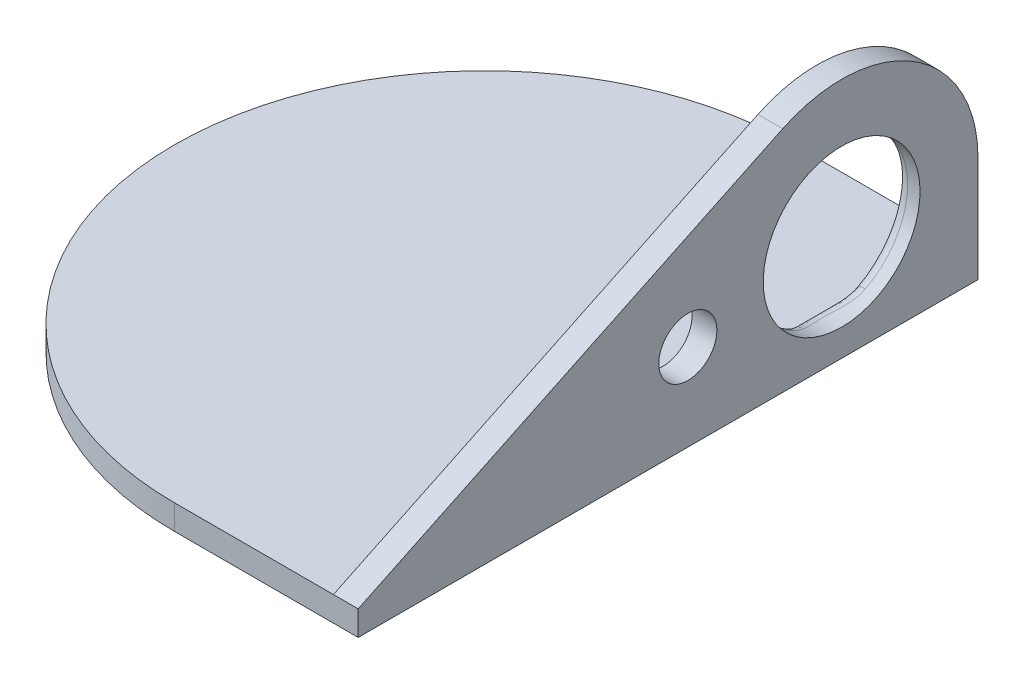
ISO-10303-21;
HEADER;
FILE_DESCRIPTION(('STEP AP214'),'2;1');
FILE_NAME('part.step','',(''),(''),'','','');
FILE_SCHEMA(('AUTOMOTIVE_DESIGN { 1 0 10303 214 1 1 1 1 }'));
ENDSEC;
DATA;
#1=APPLICATION_CONTEXT('core data for automotive mechanical design processes');
#2=APPLICATION_PROTOCOL_DEFINITION('international standard','automotive_design',2000,#1);
#3=PRODUCT_CONTEXT('',#1,'mechanical');
#4=PRODUCT('Part','Part','',(#3));
#5=PRODUCT_RELATED_PRODUCT_CATEGORY('part','',(#4));
#6=PRODUCT_DEFINITION_FORMATION('','',#4);
#7=PRODUCT_DEFINITION_CONTEXT('part definition',#1,'design');
#8=PRODUCT_DEFINITION('design','',#6,#7);
#9=PRODUCT_DEFINITION_SHAPE('','',#8);
#10=(LENGTH_UNIT() NAMED_UNIT(*) SI_UNIT(.MILLI.,.METRE.));
#11=(NAMED_UNIT(*) PLANE_ANGLE_UNIT() SI_UNIT($,.RADIAN.));
#12=(NAMED_UNIT(*) SI_UNIT($,.STERADIAN.) SOLID_ANGLE_UNIT());
#13=UNCERTAINTY_MEASURE_WITH_UNIT(LENGTH_MEASURE(1.E-05),#10,'distance_accuracy_value','');
#14=(GEOMETRIC_REPRESENTATION_CONTEXT(3) GLOBAL_UNCERTAINTY_ASSIGNED_CONTEXT((#13)) GLOBAL_UNIT_ASSIGNED_CONTEXT((#10,
#11,#12)) REPRESENTATION_CONTEXT('',''));
#15=CARTESIAN_POINT('',(0.,0.,0.));
#16=DIRECTION('',(0.,0.,1.));
#17=DIRECTION('',(1.,0.,0.));
#18=AXIS2_PLACEMENT_3D('',#15,#16,#17);
#19=CARTESIAN_POINT('',(0.,0.,12.7));
#20=DIRECTION('',(0.,1.,0.));
#21=DIRECTION('',(-1.,0.,0.));
#22=AXIS2_PLACEMENT_3D('',#19,#20,#21);
#23=PLANE('',#22);
#24=CARTESIAN_POINT('',(-6.5200926909055,0.,0.));
#25=DIRECTION('',(0.,1.,0.));
#26=DIRECTION('',(-1.,0.,0.));
#27=AXIS2_PLACEMENT_3D('',#24,#25,#26);
#28=CIRCLE('',#27,12.7);
#29=CARTESIAN_POINT('',(-15.0630371746587,0.,-9.39723893212848));
#30=VERTEX_POINT('',#29);
#31=CARTESIAN_POINT('',(-15.0630371746587,0.,9.39723893212848));
#32=VERTEX_POINT('',#31);
#33=EDGE_CURVE('E182',#30,#32,#28,.T.);
#34=ORIENTED_EDGE('',*,*,#33,.T.);
#35=CARTESIAN_POINT('',(-6.5200926909055,0.,0.));
#36=DIRECTION('',(0.,1.,0.));
#37=DIRECTION('',(-1.,0.,0.));
#38=AXIS2_PLACEMENT_3D('',#35,#36,#37);
#39=CIRCLE('',#38,12.7);
#40=CARTESIAN_POINT('',(-6.5200926909055,0.,12.7));
#41=VERTEX_POINT('',#40);
#42=EDGE_CURVE('E187',#32,#41,#39,.T.);
#43=ORIENTED_EDGE('',*,*,#42,.T.);
#44=DIRECTION('',(1.,0.,0.));
#45=VECTOR('',#44,1.);
#46=CARTESIAN_POINT('',(0.,0.,12.7));
#47=LINE('',#46,#45);
#48=CARTESIAN_POINT('',(0.,0.,12.7));
#49=VERTEX_POINT('',#48);
#50=EDGE_CURVE('E164',#41,#49,#47,.T.);
#51=ORIENTED_EDGE('',*,*,#50,.T.);
#52=DIRECTION('',(0.,0.,-1.));
#53=VECTOR('',#52,1.);
#54=CARTESIAN_POINT('',(0.,0.,12.7));
#55=LINE('',#54,#53);
#56=CARTESIAN_POINT('',(0.,0.,-5.39637148251727));
#57=VERTEX_POINT('',#56);
#58=EDGE_CURVE('E180',#49,#57,#55,.T.);
#59=ORIENTED_EDGE('',*,*,#58,.T.);
#60=CARTESIAN_POINT('',(0.,0.,-8.82762851748273));
#61=VERTEX_POINT('',#60);
#62=EDGE_CURVE('E183',#57,#61,#55,.T.);
#63=ORIENTED_EDGE('',*,*,#62,.T.);
#64=CARTESIAN_POINT('',(0.,0.,-12.7));
#65=VERTEX_POINT('',#64);
#66=EDGE_CURVE('E179',#61,#65,#55,.T.);
#67=ORIENTED_EDGE('',*,*,#66,.T.);
#68=DIRECTION('',(1.,0.,0.));
#69=VECTOR('',#68,1.);
#70=CARTESIAN_POINT('',(0.,0.,-12.7));
#71=LINE('',#70,#69);
#72=CARTESIAN_POINT('',(-6.5200926909055,0.,-12.7));
#73=VERTEX_POINT('',#72);
#74=EDGE_CURVE('E174',#73,#65,#71,.T.);
#75=ORIENTED_EDGE('',*,*,#74,.F.);
#76=CARTESIAN_POINT('',(-6.5200926909055,0.,0.));
#77=DIRECTION('',(0.,1.,0.));
#78=DIRECTION('',(-1.,0.,0.));
#79=AXIS2_PLACEMENT_3D('',#76,#77,#78);
#80=CIRCLE('',#79,12.7);
#81=EDGE_CURVE('E185',#73,#30,#80,.T.);
#82=ORIENTED_EDGE('',*,*,#81,.T.);
#83=EDGE_LOOP('',(#34,#43,#51,#59,#63,#67,#75,#82));
#84=FACE_BOUND('',#83,.T.);
#85=ADVANCED_FACE('F35',(#84),#23,.T.);
#86=CARTESIAN_POINT('',(0.,-1.016,12.7));
#87=DIRECTION('',(0.,1.,0.));
#88=DIRECTION('',(-1.,0.,0.));
#89=AXIS2_PLACEMENT_3D('',#86,#87,#88);
#90=PLANE('',#89);
#91=DIRECTION('',(1.,0.,0.));
#92=VECTOR('',#91,1.);
#93=CARTESIAN_POINT('',(0.,-1.016,12.7));
#94=LINE('',#93,#92);
#95=CARTESIAN_POINT('',(-6.5200926909055,-1.016,12.7));
#96=VERTEX_POINT('',#95);
#97=CARTESIAN_POINT('',(1.016,-1.016,12.7));
#98=VERTEX_POINT('',#97);
#99=EDGE_CURVE('E167',#96,#98,#94,.T.);
#100=ORIENTED_EDGE('',*,*,#99,.F.);
#101=CARTESIAN_POINT('',(-6.5200926909055,-1.016,0.));
#102=DIRECTION('',(0.,1.,0.));
#103=DIRECTION('',(-1.,0.,0.));
#104=AXIS2_PLACEMENT_3D('',#101,#102,#103);
#105=CIRCLE('',#104,12.7);
#106=CARTESIAN_POINT('',(-15.0630371746587,-1.016,9.39723893212848));
#107=VERTEX_POINT('',#106);
#108=EDGE_CURVE('E196',#96,#107,#105,.F.);
#109=ORIENTED_EDGE('',*,*,#108,.T.);
#110=CARTESIAN_POINT('',(-6.5200926909055,-1.016,0.));
#111=DIRECTION('',(0.,1.,0.));
#112=DIRECTION('',(-1.,0.,0.));
#113=AXIS2_PLACEMENT_3D('',#110,#111,#112);
#114=CIRCLE('',#113,12.7);
#115=CARTESIAN_POINT('',(-15.0630371746587,-1.016,-9.39723893212848));
#116=VERTEX_POINT('',#115);
#117=EDGE_CURVE('E192',#107,#116,#114,.F.);
#118=ORIENTED_EDGE('',*,*,#117,.T.);
#119=CARTESIAN_POINT('',(-6.5200926909055,-1.016,0.));
#120=DIRECTION('',(0.,1.,0.));
#121=DIRECTION('',(-1.,0.,0.));
#122=AXIS2_PLACEMENT_3D('',#119,#120,#121);
#123=CIRCLE('',#122,12.7);
#124=CARTESIAN_POINT('',(-6.5200926909055,-1.016,-12.7));
#125=VERTEX_POINT('',#124);
#126=EDGE_CURVE('E194',#116,#125,#123,.F.);
#127=ORIENTED_EDGE('',*,*,#126,.T.);
#128=DIRECTION('',(1.,0.,0.));
#129=VECTOR('',#128,1.);
#130=CARTESIAN_POINT('',(0.,-1.016,-12.7));
#131=LINE('',#130,#129);
#132=CARTESIAN_POINT('',(1.016,-1.016,-12.7));
#133=VERTEX_POINT('',#132);
#134=EDGE_CURVE('E165',#125,#133,#131,.T.);
#135=ORIENTED_EDGE('',*,*,#134,.T.);
#136=DIRECTION('',(0.,0.,-1.));
#137=VECTOR('',#136,1.);
#138=CARTESIAN_POINT('',(1.016,-1.016,12.7));
#139=LINE('',#138,#137);
#140=EDGE_CURVE('E169',#98,#133,#139,.T.);
#141=ORIENTED_EDGE('',*,*,#140,.F.);
#142=EDGE_LOOP('',(#100,#109,#118,#127,#135,#141));
#143=FACE_BOUND('',#142,.T.);
#144=ADVANCED_FACE('F264',(#143),#90,.F.);
#145=CARTESIAN_POINT('',(0.,0.,12.7));
#146=DIRECTION('',(0.,0.,-1.));
#147=DIRECTION('',(-1.,0.,0.));
#148=AXIS2_PLACEMENT_3D('',#145,#146,#147);
#149=PLANE('',#148);
#150=ORIENTED_EDGE('',*,*,#50,.F.);
#151=DIRECTION('',(0.,1.,0.));
#152=VECTOR('',#151,1.);
#153=CARTESIAN_POINT('',(-6.5200926909055,-1.016,12.7));
#154=LINE('',#153,#152);
#155=EDGE_CURVE('E189',#41,#96,#154,.F.);
#156=ORIENTED_EDGE('',*,*,#155,.T.);
#157=ORIENTED_EDGE('',*,*,#99,.T.);
#158=DIRECTION('',(0.,1.,0.));
#159=VECTOR('',#158,1.);
#160=CARTESIAN_POINT('',(1.016,0.,12.7));
#161=LINE('',#160,#159);
#162=CARTESIAN_POINT('',(1.01600000000001,0.,12.7));
#163=VERTEX_POINT('',#162);
#164=EDGE_CURVE('E162',#98,#163,#161,.T.);
#165=ORIENTED_EDGE('',*,*,#164,.T.);
#166=DIRECTION('',(-1.,0.,0.));
#167=VECTOR('',#166,1.);
#168=CARTESIAN_POINT('',(1.01600000000001,0.,12.7));
#169=LINE('',#168,#167);
#170=EDGE_CURVE('E132',#163,#49,#169,.T.);
#171=ORIENTED_EDGE('',*,*,#170,.T.);
#172=EDGE_LOOP('',(#150,#156,#157,#165,#171));
#173=FACE_BOUND('',#172,.T.);
#174=ADVANCED_FACE('F258',(#173),#149,.F.);
#175=CARTESIAN_POINT('',(0.,0.,-12.7));
#176=DIRECTION('',(0.,0.,-1.));
#177=DIRECTION('',(-1.,0.,0.));
#178=AXIS2_PLACEMENT_3D('',#175,#176,#177);
#179=PLANE('',#178);
#180=ORIENTED_EDGE('',*,*,#134,.F.);
#181=DIRECTION('',(0.,1.,0.));
#182=VECTOR('',#181,1.);
#183=CARTESIAN_POINT('',(-6.5200926909055,0.,-12.7));
#184=LINE('',#183,#182);
#185=EDGE_CURVE('E198',#125,#73,#184,.T.);
#186=ORIENTED_EDGE('',*,*,#185,.T.);
#187=ORIENTED_EDGE('',*,*,#74,.T.);
#188=DIRECTION('',(0.,1.,0.));
#189=VECTOR('',#188,1.);
#190=CARTESIAN_POINT('',(0.,0.,-12.7));
#191=LINE('',#190,#189);
#192=CARTESIAN_POINT('',(0.,3.302,-12.7));
#193=VERTEX_POINT('',#192);
#194=EDGE_CURVE('E171',#65,#193,#191,.T.);
#195=ORIENTED_EDGE('',*,*,#194,.T.);
#196=DIRECTION('',(-1.,0.,0.));
#197=VECTOR('',#196,1.);
#198=CARTESIAN_POINT('',(1.01600000000001,3.302,-12.7));
#199=LINE('',#198,#197);
#200=CARTESIAN_POINT('',(1.016,3.302,-12.7));
#201=VERTEX_POINT('',#200);
#202=EDGE_CURVE('E133',#201,#193,#199,.T.);
#203=ORIENTED_EDGE('',*,*,#202,.F.);
#204=DIRECTION('',(0.,1.,0.));
#205=VECTOR('',#204,1.);
#206=CARTESIAN_POINT('',(1.016,0.,-12.7));
#207=LINE('',#206,#205);
#208=EDGE_CURVE('E147',#133,#201,#207,.T.);
#209=ORIENTED_EDGE('',*,*,#208,.F.);
#210=EDGE_LOOP('',(#180,#186,#187,#195,#203,#209));
#211=FACE_BOUND('',#210,.T.);
#212=ADVANCED_FACE('F250',(#211),#179,.T.);
#213=CARTESIAN_POINT('',(1.016,0.,12.7));
#214=DIRECTION('',(-1.,0.,0.));
#215=DIRECTION('',(0.,-1.,0.));
#216=AXIS2_PLACEMENT_3D('',#213,#214,#215);
#217=PLANE('',#216);
#218=CARTESIAN_POINT('',(1.01600000000001,2.54,-0.807885787836645));
#219=DIRECTION('',(-1.,0.,0.));
#220=DIRECTION('',(0.,-1.,0.));
#221=AXIS2_PLACEMENT_3D('',#218,#219,#220);
#222=CIRCLE('',#221,1.190625);
#223=CARTESIAN_POINT('',(1.01600000000001,1.349375,-0.807885787836645));
#224=VERTEX_POINT('',#223);
#225=EDGE_CURVE('E155',#224,#224,#222,.T.);
#226=ORIENTED_EDGE('',*,*,#225,.T.);
#227=EDGE_LOOP('',(#226));
#228=FACE_BOUND('',#227,.T.);
#229=CARTESIAN_POINT('',(1.016,3.302,-7.112));
#230=DIRECTION('',(-1.,0.,0.));
#231=DIRECTION('',(0.,-1.,0.));
#232=AXIS2_PLACEMENT_3D('',#229,#230,#231);
#233=CIRCLE('',#232,3.2131);
#234=CARTESIAN_POINT('',(1.01600000000001,0.0889000000000003,-7.112));
#235=VERTEX_POINT('',#234);
#236=EDGE_CURVE('E157',#235,#235,#233,.T.);
#237=ORIENTED_EDGE('',*,*,#236,.T.);
#238=EDGE_LOOP('',(#237));
#239=FACE_BOUND('',#238,.T.);
#240=CARTESIAN_POINT('',(1.01600000000001,3.302,-7.112));
#241=DIRECTION('',(1.,0.,0.));
#242=DIRECTION('',(0.,-1.,0.));
#243=AXIS2_PLACEMENT_3D('',#240,#241,#242);
#244=CIRCLE('',#243,5.588);
#245=CARTESIAN_POINT('',(1.01600000000001,8.34076814817256,-4.69610274453534));
#246=VERTEX_POINT('',#245);
#247=EDGE_CURVE('E125',#201,#246,#244,.T.);
#248=ORIENTED_EDGE('',*,*,#247,.T.);
#249=DIRECTION('',(0.,-0.432336659889881,0.901712267031596));
#250=VECTOR('',#249,1.);
#251=CARTESIAN_POINT('',(1.01600000000001,0.,12.7));
#252=LINE('',#251,#250);
#253=EDGE_CURVE('E136',#246,#163,#252,.T.);
#254=ORIENTED_EDGE('',*,*,#253,.T.);
#255=ORIENTED_EDGE('',*,*,#164,.F.);
#256=ORIENTED_EDGE('',*,*,#140,.T.);
#257=ORIENTED_EDGE('',*,*,#208,.T.);
#258=EDGE_LOOP('',(#248,#254,#255,#256,#257));
#259=FACE_BOUND('',#258,.T.);
#260=ADVANCED_FACE('F144',(#228,#239,#259),#217,.F.);
#261=CARTESIAN_POINT('',(0.,0.,12.7));
#262=DIRECTION('',(-1.,0.,0.));
#263=DIRECTION('',(0.,-1.,0.));
#264=AXIS2_PLACEMENT_3D('',#261,#262,#263);
#265=PLANE('',#264);
#266=CARTESIAN_POINT('',(0.,2.54,-0.807885787836645));
#267=DIRECTION('',(-1.,0.,0.));
#268=DIRECTION('',(0.,-1.,0.));
#269=AXIS2_PLACEMENT_3D('',#266,#267,#268);
#270=CIRCLE('',#269,1.190625);
#271=CARTESIAN_POINT('',(0.,1.349375,-0.807885787836645));
#272=VERTEX_POINT('',#271);
#273=EDGE_CURVE('E152',#272,#272,#270,.T.);
#274=ORIENTED_EDGE('',*,*,#273,.F.);
#275=EDGE_LOOP('',(#274));
#276=FACE_BOUND('',#275,.T.);
#277=ORIENTED_EDGE('',*,*,#66,.F.);
#278=CARTESIAN_POINT('',(0.,3.302,-7.112));
#279=DIRECTION('',(-1.,0.,0.));
#280=DIRECTION('',(0.,-1.,0.));
#281=AXIS2_PLACEMENT_3D('',#278,#279,#280);
#282=CIRCLE('',#281,3.7211);
#283=EDGE_CURVE('E11',#61,#57,#282,.F.);
#284=ORIENTED_EDGE('',*,*,#283,.T.);
#285=ORIENTED_EDGE('',*,*,#58,.F.);
#286=DIRECTION('',(0.,-0.432336659889881,0.901712267031596));
#287=VECTOR('',#286,1.);
#288=CARTESIAN_POINT('',(0.,0.,12.7));
#289=LINE('',#288,#287);
#290=CARTESIAN_POINT('',(0.,8.34076814817256,-4.69610274453534));
#291=VERTEX_POINT('',#290);
#292=EDGE_CURVE('E148',#291,#49,#289,.T.);
#293=ORIENTED_EDGE('',*,*,#292,.F.);
#294=CARTESIAN_POINT('',(0.,3.302,-7.112));
#295=DIRECTION('',(1.,0.,0.));
#296=DIRECTION('',(0.,-1.,0.));
#297=AXIS2_PLACEMENT_3D('',#294,#295,#296);
#298=CIRCLE('',#297,5.588);
#299=EDGE_CURVE('E128',#193,#291,#298,.T.);
#300=ORIENTED_EDGE('',*,*,#299,.F.);
#301=ORIENTED_EDGE('',*,*,#194,.F.);
#302=EDGE_LOOP('',(#277,#284,#285,#293,#300,#301));
#303=FACE_BOUND('',#302,.T.);
#304=ADVANCED_FACE('F232',(#276,#303),#265,.T.);
#305=CARTESIAN_POINT('',(1.016,3.302,-7.112));
#306=DIRECTION('',(-1.,0.,0.));
#307=DIRECTION('',(0.,-1.,0.));
#308=AXIS2_PLACEMENT_3D('',#305,#306,#307);
#309=CYLINDRICAL_SURFACE('',#308,3.2131);
#310=CARTESIAN_POINT('',(0.507999999999999,3.302,-7.112));
#311=DIRECTION('',(-1.,0.,0.));
#312=DIRECTION('',(0.,-1.,0.));
#313=AXIS2_PLACEMENT_3D('',#310,#311,#312);
#314=CIRCLE('',#313,3.2131);
#315=CARTESIAN_POINT('',(0.508,0.450784982935154,-5.63058697978453));
#316=VERTEX_POINT('',#315);
#317=CARTESIAN_POINT('',(0.508,0.450784982935154,-8.59341302021547));
#318=VERTEX_POINT('',#317);
#319=EDGE_CURVE('E200',#316,#318,#314,.T.);
#320=ORIENTED_EDGE('',*,*,#319,.T.);
#321=CARTESIAN_POINT('',(0.,0.,-9.19509326100825));
#322=CARTESIAN_POINT('',(-0.25413207970751,0.533073828490574,-8.75310797004754));
#323=CARTESIAN_POINT('',(0.458557134017713,0.639548684302181,-8.91071192844739));
#324=CARTESIAN_POINT('',(0.,0.,-9.16356441500061));
#325=CARTESIAN_POINT('',(-0.224612929921131,0.53358220059172,-8.7505050021578));
#326=CARTESIAN_POINT('',(0.468685096412562,0.621149768920031,-8.88348736172624));
#327=CARTESIAN_POINT('',(0.,0.,-9.13134367540119));
#328=CARTESIAN_POINT('',(-0.196035209282501,0.530685799042681,-8.74342010004847));
#329=CARTESIAN_POINT('',(0.476936986791959,0.602968474081926,-8.85566535790406));
#330=CARTESIAN_POINT('',(0.,0.,-9.06586548255135));
#331=CARTESIAN_POINT('',(-0.143109161139071,0.520114580939787,-8.72229266649017));
#332=CARTESIAN_POINT('',(0.490245052873632,0.567274446896974,-8.79912616750279));
#333=CARTESIAN_POINT('',(0.,0.,-9.03261065902777));
#334=CARTESIAN_POINT('',(-0.118511399012816,0.512639923167853,-8.70853492185666));
#335=CARTESIAN_POINT('',(0.495308734130547,0.54976023622804,-8.77041125164342));
#336=CARTESIAN_POINT('',(0.,0.,-8.93252370373043));
#337=CARTESIAN_POINT('',(-0.0531328310514806,0.486762040320877,-8.66106745813207));
#338=CARTESIAN_POINT('',(0.506499498833184,0.498914484043824,-8.68398804453493));
#339=CARTESIAN_POINT('',(0.,0.,-8.86447637390507));
#340=CARTESIAN_POINT('',(-0.0162171661181189,0.464285333913872,-8.62000244777006));
#341=CARTESIAN_POINT('',(0.508875185884747,0.466757591161227,-8.62523045255777));
#342=CARTESIAN_POINT('',(0.,0.,-8.72961245909783));
#343=CARTESIAN_POINT('',(0.041768039409489,0.417787947783148,-8.52902552776654));
#344=CARTESIAN_POINT('',(0.506640232112359,0.407678233217152,-8.50877799368729));
#345=CARTESIAN_POINT('',(0.,0.,-8.66288679604253));
#346=CARTESIAN_POINT('',(0.0643843504205436,0.393898049495785,-8.47993004096156));
#347=CARTESIAN_POINT('',(0.502350663728295,0.380581453647793,-8.45116163617019));
#348=CARTESIAN_POINT('',(0.,0.,-8.52805513492818));
#349=CARTESIAN_POINT('',(0.0998604784745352,0.347028391001747,-8.37575810650598));
#350=CARTESIAN_POINT('',(0.48927362922279,0.329971195671504,-8.33473702777044));
#351=CARTESIAN_POINT('',(0.,0.,-8.45994852114491));
#352=CARTESIAN_POINT('',(0.113266470501912,0.323844634219524,-8.32057406561441));
#353=CARTESIAN_POINT('',(0.4804841123861,0.306459357338584,-8.27592824522148));
#354=CARTESIAN_POINT('',(0.,0.,-8.32187428708854));
#355=CARTESIAN_POINT('',(0.133084519689477,0.279756394921916,-8.20576493626821));
#356=CARTESIAN_POINT('',(0.45981066898839,0.262808518828219,-8.15670373594938));
#357=CARTESIAN_POINT('',(0.,0.,-8.25189425165337));
#358=CARTESIAN_POINT('',(0.13973713902192,0.258639467801114,-8.14583879191707));
#359=CARTESIAN_POINT('',(0.447892112635386,0.242711695324989,-8.09627728896679));
#360=CARTESIAN_POINT('',(0.,0.,-8.11096984714114));
#361=CARTESIAN_POINT('',(0.147997343453885,0.219805860001998,-8.02336049538235));
#362=CARTESIAN_POINT('',(0.422420158737223,0.206199244645878,-7.97459171100901));
#363=CARTESIAN_POINT('',(0.,0.,-8.04002556491357));
#364=CARTESIAN_POINT('',(0.149770319248798,0.201879894805378,-7.96052166075148));
#365=CARTESIAN_POINT('',(0.408866907574123,0.189783288235114,-7.91333265502674));
#366=CARTESIAN_POINT('',(0.,0.,-7.88953365176918));
#367=CARTESIAN_POINT('',(0.15015500038,0.168175233324832,-7.82626004451216));
#368=CARTESIAN_POINT('',(0.380113515816031,0.159043388779212,-7.78338571296224));
#369=CARTESIAN_POINT('',(0.,0.,-7.80987712822243));
#370=CARTESIAN_POINT('',(0.148497405074557,0.152569167825823,-7.75406438807793));
#371=CARTESIAN_POINT('',(0.364892219586929,0.145130746868775,-7.71460380013776));
#372=CARTESIAN_POINT('',(0.,0.,-7.64928112792265));
#373=CARTESIAN_POINT('',(0.143603678641132,0.126390062206482,-7.60790978192991));
#374=CARTESIAN_POINT('',(0.33657099178796,0.121792050849862,-7.57593216847898));
#375=CARTESIAN_POINT('',(0.,0.,-7.56834149285989));
#376=CARTESIAN_POINT('',(0.140377721040551,0.115649447864114,-7.5335071682397));
#377=CARTESIAN_POINT('',(0.32347132425565,0.112366554885888,-7.50604231294717));
#378=CARTESIAN_POINT('',(0.,0.,-7.40607352931039));
#379=CARTESIAN_POINT('',(0.134667211140058,0.0995442592678551,-7.38421777331584));
#380=CARTESIAN_POINT('',(0.302486576773661,0.0981850032613021,-7.365926972408));
#381=CARTESIAN_POINT('',(0.,0.,-7.32475877869045));
#382=CARTESIAN_POINT('',(0.132150444223693,0.0940217291913368,-7.30889460993711));
#383=CARTESIAN_POINT('',(0.294546847745681,0.0933797442835387,-7.29571321163375));
#384=CARTESIAN_POINT('',(0.,0.,-7.16159823197597));
#385=CARTESIAN_POINT('',(0.129553705816979,0.08835158540101,-7.15804292293858));
#386=CARTESIAN_POINT('',(0.286323248005844,0.0884145649019498,-7.1548271422864));
#387=CARTESIAN_POINT('',(0.,0.,-7.07975316731804));
#388=CARTESIAN_POINT('',(0.129454152702233,0.0881609648676684,-7.08203057317626));
#389=CARTESIAN_POINT('',(0.286030443499031,0.0882492237302115,-7.08415546529509));
#390=CARTESIAN_POINT('',(0.,0.,-6.91651543550606));
#391=CARTESIAN_POINT('',(0.13172796106079,0.0930849102059866,-6.93108273536618));
#392=CARTESIAN_POINT('',(0.293199240328304,0.0925600992240954,-6.94320274806496));
#393=CARTESIAN_POINT('',(0.,0.,-6.83512342773659));
#394=CARTESIAN_POINT('',(0.134119142030147,0.0982378535576874,-6.85566181744347));
#395=CARTESIAN_POINT('',(0.300670131240911,0.0970418763410485,-6.87292227719234));
#396=CARTESIAN_POINT('',(0.,0.,-6.67343669524411));
#397=CARTESIAN_POINT('',(0.139700914657525,0.113553203665037,-6.70683638344518));
#398=CARTESIAN_POINT('',(0.32083737539932,0.110520985915884,-6.73330881876027));
#399=CARTESIAN_POINT('',(0.,0.,-6.59314389783001));
#400=CARTESIAN_POINT('',(0.14291838158567,0.123820883928031,-6.63297654850332));
#401=CARTESIAN_POINT('',(0.333541929397121,0.119525409893976,-6.66397749539591));
#402=CARTESIAN_POINT('',(0.,0.,-6.43298353303459));
#403=CARTESIAN_POINT('',(0.14802054703342,0.149136535882496,-6.48704455114929));
#404=CARTESIAN_POINT('',(0.361390508022967,0.142062844137493,-6.52568202681829));
#405=CARTESIAN_POINT('',(0.,0.,-6.35312913761984));
#406=CARTESIAN_POINT('',(0.149884645410555,0.164394168609403,-6.41456704522763));
#407=CARTESIAN_POINT('',(0.376558596516256,0.155642112504526,-6.45672925535093));
#408=CARTESIAN_POINT('',(0.,0.,-6.19467721400785));
#409=CARTESIAN_POINT('',(0.150054893209164,0.19918498645035,-6.27278211242067));
#410=CARTESIAN_POINT('',(0.406813891517293,0.187272485726308,-6.31990899366547));
#411=CARTESIAN_POINT('',(0.,0.,-6.11607874013792));
#412=CARTESIAN_POINT('',(0.148278408211382,0.218941268891462,-6.20304728348275));
#413=CARTESIAN_POINT('',(0.421901152585455,0.205320039082289,-6.25204068687677));
#414=CARTESIAN_POINT('',(0.,0.,-5.92400386383029));
#415=CARTESIAN_POINT('',(0.136634114502832,0.272499257114465,-6.03495534893579));
#416=CARTESIAN_POINT('',(0.456537059880813,0.255311744762699,-6.08618763668623));
#417=CARTESIAN_POINT('',(0.,0.,-5.81118900638866));
#418=CARTESIAN_POINT('',(0.122906282975873,0.308775882908603,-5.93902494358726));
#419=CARTESIAN_POINT('',(0.474926888248697,0.2898240739918,-5.98877412497041));
#420=CARTESIAN_POINT('',(0.,0.,-5.58963795631448));
#421=CARTESIAN_POINT('',(0.0748610643095872,0.384220699075412,-5.76242584130591));
#422=CARTESIAN_POINT('',(0.501173077850294,0.368304313166151,-5.79746895203946));
#423=CARTESIAN_POINT('',(0.,0.,-5.48087482514988));
#424=CARTESIAN_POINT('',(0.0387180137995543,0.42437246233603,-5.68086407381666));
#425=CARTESIAN_POINT('',(0.509119655040796,0.412187380088722,-5.70355402990758));
#426=CARTESIAN_POINT('',(0.,0.,-5.32094946520634));
#427=CARTESIAN_POINT('',(-0.0369199810012036,0.476424046434741,-5.58165815431715));
#428=CARTESIAN_POINT('',(0.507242158703748,0.485087515876225,-5.56546148360821));
#429=CARTESIAN_POINT('',(0.,0.,-5.26774800074486));
#430=CARTESIAN_POINT('',(-0.0678128604639028,0.493126669244793,-5.5513262553115));
#431=CARTESIAN_POINT('',(0.504232173114268,0.510811751503015,-5.51952301770802));
#432=CARTESIAN_POINT('',(0.,0.,-5.16302630665207));
#433=CARTESIAN_POINT('',(-0.13870253189398,0.519920392997573,-5.50203653313889));
#434=CARTESIAN_POINT('',(0.491676917755456,0.564360306086887,-5.42909780062448));
#435=CARTESIAN_POINT('',(0.,0.,-5.11152330485104));
#436=CARTESIAN_POINT('',(-0.179580506401903,0.529593624780564,-5.48378852230795));
#437=CARTESIAN_POINT('',(0.482078605733739,0.592200026772987,-5.38462592534919));
#438=CARTESIAN_POINT('',(0.,0.,-5.06144065372412));
#439=CARTESIAN_POINT('',(-0.223834842314751,0.532422717808514,-5.47518462161213));
#440=CARTESIAN_POINT('',(0.468298644144476,0.62078419689299,-5.34138049621912));
#441=(BOUNDED_SURFACE() B_SPLINE_SURFACE(3,2,((#321,#322,#323),(#324,#325,#326),(#327,#328,
#329),(#330,#331,#332),(#333,#334,#335),(#336,#337,#338),(#339,#340,#341),(#342,#343,#344),
(#345,#346,#347),(#348,#349,#350),(#351,#352,#353),(#354,#355,#356),(#357,#358,#359),(#360,#361,
#362),(#363,#364,#365),(#366,#367,#368),(#369,#370,#371),(#372,#373,#374),(#375,#376,#377),
(#378,#379,#380),(#381,#382,#383),(#384,#385,#386),(#387,#388,#389),(#390,#391,#392),(#393,#394,
#395),(#396,#397,#398),(#399,#400,#401),(#402,#403,#404),(#405,#406,#407),(#408,#409,#410),
(#411,#412,#413),(#414,#415,#416),(#417,#418,#419),(#420,#421,#422),(#423,#424,#425),(#426,#427,
#428),(#429,#430,#431),(#432,#433,#434),(#435,#436,#437),(#438,#439,#440)),.UNSPECIFIED.,.F.,
.F.,.F.) B_SPLINE_SURFACE_WITH_KNOTS((4,2,2,2,2,2,2,2,2,2,2,2,2,2,2,2,2,2,2,4),(3,3),(0.,
0.117986382416477,0.235693957124253,0.46782587212045,0.689117499837568,0.910510064399714,
1.13446445332296,1.35839880266487,1.6062745224941,1.85418106689347,2.09941728394648,
2.34436698212462,2.58961011039771,2.8352389865556,3.08343002607939,3.33142442724078,
3.69398419528682,4.05339087476376,4.23616773268615,4.42043364762623),(0.,1.),
.UNSPECIFIED.) GEOMETRIC_REPRESENTATION_ITEM() RATIONAL_B_SPLINE_SURFACE(((1.,0.567194010858234,
1.),(1.,0.581424409946974,1.),(1.,0.595274550666373,1.),(1.,0.622137114286821,1.),(1.,
0.635151439417621,1.),(1.,0.672572359693193,1.),(1.,0.695755028890824,1.),(1.,0.737825497372917,
1.),(1.,0.756863305724939,1.),(1.,0.792125458286055,1.),(1.,0.808348515240424,1.),(1.,
0.838287575645313,1.),(1.,0.851972396721665,1.),(1.,0.876727811417831,1.),(1.,0.88779863885081,
1.),(1.,0.908466712469673,1.),(1.,0.917779871896113,1.),(1.,0.933370738493142,1.),(1.,
0.939648068046228,1.),(1.,0.949083382984994,1.),(1.,0.952274240081993,1.),(1.,0.955571175479434,
1.),(1.,0.95568085348965,1.),(1.,0.952818580977831,1.),(1.,0.949842938754553,1.),(1.,
0.940876768912888,1.),(1.,0.934881506482157,1.),(1.,0.919832052065555,1.),(1.,0.910746604602357,
1.),(1.,0.889492242875085,1.),(1.,0.877325777302632,1.),(1.,0.843426624583329,1.),(1.,
0.819871147793111,1.),(1.,0.765530604918343,1.),(1.,0.734810194281529,1.),(1.,0.682507180832938,
1.),(1.,0.66385345662224,1.),(1.,0.624362318215461,1.),(1.,0.603508351879909,1.),(1.,
0.581636324775406,1.))) REPRESENTATION_ITEM('') SURFACE());
#442=CARTESIAN_POINT('',(0.458557134017713,0.639548684302181,-8.91071192844739));
#443=CARTESIAN_POINT('',(0.468685096412562,0.621149768920031,-8.88348736172624));
#444=CARTESIAN_POINT('',(0.476936986791959,0.602968474081926,-8.85566535790406));
#445=CARTESIAN_POINT('',(0.490245052873632,0.567274446896974,-8.79912616750279));
#446=CARTESIAN_POINT('',(0.495308734130547,0.54976023622804,-8.77041125164343));
#447=CARTESIAN_POINT('',(0.506499498833184,0.498914484043824,-8.68398804453493));
#448=CARTESIAN_POINT('',(0.508875185884747,0.466757591161227,-8.62523045255777));
#449=CARTESIAN_POINT('',(0.506640232112359,0.407678233217152,-8.50877799368729));
#450=CARTESIAN_POINT('',(0.502350663728296,0.380581453647793,-8.45116163617019));
#451=CARTESIAN_POINT('',(0.48927362922279,0.329971195671504,-8.33473702777044));
#452=CARTESIAN_POINT('',(0.4804841123861,0.306459357338584,-8.27592824522148));
#453=CARTESIAN_POINT('',(0.45981066898839,0.262808518828219,-8.15670373594938));
#454=CARTESIAN_POINT('',(0.447892112635386,0.242711695324989,-8.09627728896679));
#455=CARTESIAN_POINT('',(0.422420158737223,0.206199244645878,-7.97459171100902));
#456=CARTESIAN_POINT('',(0.408866907574123,0.189783288235114,-7.91333265502674));
#457=CARTESIAN_POINT('',(0.380113515816031,0.159043388779212,-7.78338571296224));
#458=CARTESIAN_POINT('',(0.364892219586929,0.145130746868775,-7.71460380013776));
#459=CARTESIAN_POINT('',(0.33657099178796,0.121792050849862,-7.57593216847898));
#460=CARTESIAN_POINT('',(0.32347132425565,0.112366554885888,-7.50604231294717));
#461=CARTESIAN_POINT('',(0.302486576773661,0.0981850032613021,-7.365926972408));
#462=CARTESIAN_POINT('',(0.294546847745681,0.0933797442835387,-7.29571321163375));
#463=CARTESIAN_POINT('',(0.286323248005844,0.0884145649019498,-7.1548271422864));
#464=CARTESIAN_POINT('',(0.286030443499031,0.0882492237302115,-7.08415546529509));
#465=CARTESIAN_POINT('',(0.293199240328304,0.0925600992240954,-6.94320274806496));
#466=CARTESIAN_POINT('',(0.300670131240911,0.0970418763410485,-6.87292227719234));
#467=CARTESIAN_POINT('',(0.32083737539932,0.110520985915884,-6.73330881876027));
#468=CARTESIAN_POINT('',(0.333541929397121,0.119525409893976,-6.6639774953959));
#469=CARTESIAN_POINT('',(0.361390508022967,0.142062844137493,-6.52568202681829));
#470=CARTESIAN_POINT('',(0.376558596516256,0.155642112504526,-6.45672925535093));
#471=CARTESIAN_POINT('',(0.406813891517293,0.187272485726308,-6.31990899366547));
#472=CARTESIAN_POINT('',(0.421901152585455,0.205320039082289,-6.25204068687677));
#473=CARTESIAN_POINT('',(0.456537059880813,0.255311744762699,-6.08618763668623));
#474=CARTESIAN_POINT('',(0.474926888248697,0.2898240739918,-5.98877412497041));
#475=CARTESIAN_POINT('',(0.501173077850294,0.368304313166151,-5.79746895203946));
#476=CARTESIAN_POINT('',(0.509119655040796,0.412187380088722,-5.70355402990758));
#477=CARTESIAN_POINT('',(0.507242158703748,0.485087515876225,-5.56546148360821));
#478=CARTESIAN_POINT('',(0.504232173114268,0.510811751503015,-5.51952301770802));
#479=CARTESIAN_POINT('',(0.491676917755456,0.564360306086887,-5.42909780062448));
#480=CARTESIAN_POINT('',(0.482078605733739,0.592200026772987,-5.38462592534919));
#481=CARTESIAN_POINT('',(0.468298644144476,0.62078419689299,-5.34138049621912));
#482=B_SPLINE_CURVE_WITH_KNOTS('',3,(#442,#443,#444,#445,#446,#447,#448,#449,#450,#451,#452,
#453,#454,#455,#456,#457,#458,#459,#460,#461,#462,#463,#464,#465,#466,#467,#468,#469,#470,#471,
#472,#473,#474,#475,#476,#477,#478,#479,#480,#481),.UNSPECIFIED.,.F.,.F.,(4,2,2,2,2,2,2,2,2,2,2,
2,2,2,2,2,2,2,2,4),(0.,0.117986382416477,0.235693957124253,0.46782587212045,0.689117499837568,
0.910510064399714,1.13446445332296,1.35839880266487,1.6062745224941,1.85418106689347,
2.09941728394648,2.34436698212462,2.58961011039771,2.8352389865556,3.08343002607939,
3.33142442724078,3.69398419528682,4.05339087476376,4.23616773268615,4.42043364762623),.UNSPECIFIED.);
#483=EDGE_CURVE('E48',#318,#316,#482,.T.);
#484=ORIENTED_EDGE('',*,*,#483,.T.);
#485=EDGE_LOOP('',(#320,#484));
#486=FACE_BOUND('',#485,.T.);
#487=ORIENTED_EDGE('',*,*,#236,.F.);
#488=EDGE_LOOP('',(#487));
#489=FACE_BOUND('',#488,.T.);
#490=ADVANCED_FACE('F215',(#486,#489),#309,.F.);
#491=CARTESIAN_POINT('',(1.01600000000001,0.,12.7));
#492=DIRECTION('',(0.,-0.901712267031596,-0.432336659889881));
#493=DIRECTION('',(0.,0.432336659889881,-0.901712267031596));
#494=AXIS2_PLACEMENT_3D('',#491,#492,#493);
#495=PLANE('',#494);
#496=ORIENTED_EDGE('',*,*,#292,.T.);
#497=ORIENTED_EDGE('',*,*,#170,.F.);
#498=ORIENTED_EDGE('',*,*,#253,.F.);
#499=DIRECTION('',(-1.,0.,0.));
#500=VECTOR('',#499,1.);
#501=CARTESIAN_POINT('',(1.01600000000001,8.34076814817256,-4.69610274453534));
#502=LINE('',#501,#500);
#503=EDGE_CURVE('E121',#246,#291,#502,.T.);
#504=ORIENTED_EDGE('',*,*,#503,.T.);
#505=EDGE_LOOP('',(#496,#497,#498,#504));
#506=FACE_BOUND('',#505,.T.);
#507=ADVANCED_FACE('F137',(#506),#495,.F.);
#508=CARTESIAN_POINT('',(1.01600000000001,3.302,-7.112));
#509=DIRECTION('',(-1.,0.,0.));
#510=DIRECTION('',(0.,-1.,0.));
#511=AXIS2_PLACEMENT_3D('',#508,#509,#510);
#512=CYLINDRICAL_SURFACE('',#511,5.588);
#513=ORIENTED_EDGE('',*,*,#299,.T.);
#514=ORIENTED_EDGE('',*,*,#503,.F.);
#515=ORIENTED_EDGE('',*,*,#247,.F.);
#516=ORIENTED_EDGE('',*,*,#202,.T.);
#517=EDGE_LOOP('',(#513,#514,#515,#516));
#518=FACE_BOUND('',#517,.T.);
#519=ADVANCED_FACE('F123',(#518),#512,.T.);
#520=CARTESIAN_POINT('',(1.01600000000001,2.54,-0.807885787836645));
#521=DIRECTION('',(-1.,0.,0.));
#522=DIRECTION('',(0.,-1.,0.));
#523=AXIS2_PLACEMENT_3D('',#520,#521,#522);
#524=CYLINDRICAL_SURFACE('',#523,1.190625);
#525=ORIENTED_EDGE('',*,*,#225,.F.);
#526=EDGE_LOOP('',(#525));
#527=FACE_BOUND('',#526,.T.);
#528=ORIENTED_EDGE('',*,*,#273,.T.);
#529=EDGE_LOOP('',(#528));
#530=FACE_BOUND('',#529,.T.);
#531=ADVANCED_FACE('F293',(#527,#530),#524,.F.);
#532=CARTESIAN_POINT('',(-6.5200926909055,0.,0.));
#533=DIRECTION('',(0.,1.,0.));
#534=DIRECTION('',(-1.,0.,0.));
#535=AXIS2_PLACEMENT_3D('',#532,#533,#534);
#536=CYLINDRICAL_SURFACE('',#535,12.7);
#537=ORIENTED_EDGE('',*,*,#185,.F.);
#538=ORIENTED_EDGE('',*,*,#126,.F.);
#539=DIRECTION('',(0.,1.,0.));
#540=VECTOR('',#539,1.);
#541=CARTESIAN_POINT('',(-15.0630371746587,-1.016,-9.39723893212848));
#542=LINE('',#541,#540);
#543=EDGE_CURVE('E204',#30,#116,#542,.F.);
#544=ORIENTED_EDGE('',*,*,#543,.F.);
#545=ORIENTED_EDGE('',*,*,#81,.F.);
#546=EDGE_LOOP('',(#537,#538,#544,#545));
#547=FACE_BOUND('',#546,.T.);
#548=ADVANCED_FACE('F222',(#547),#536,.T.);
#549=CARTESIAN_POINT('',(-6.5200926909055,-1.016,0.));
#550=DIRECTION('',(0.,1.,0.));
#551=DIRECTION('',(-1.,0.,0.));
#552=AXIS2_PLACEMENT_3D('',#549,#550,#551);
#553=CYLINDRICAL_SURFACE('',#552,12.7);
#554=ORIENTED_EDGE('',*,*,#543,.T.);
#555=ORIENTED_EDGE('',*,*,#117,.F.);
#556=DIRECTION('',(0.,1.,0.));
#557=VECTOR('',#556,1.);
#558=CARTESIAN_POINT('',(-15.0630371746587,-1.016,9.39723893212848));
#559=LINE('',#558,#557);
#560=EDGE_CURVE('E201',#32,#107,#559,.F.);
#561=ORIENTED_EDGE('',*,*,#560,.F.);
#562=ORIENTED_EDGE('',*,*,#33,.F.);
#563=EDGE_LOOP('',(#554,#555,#561,#562));
#564=FACE_BOUND('',#563,.T.);
#565=ADVANCED_FACE('F280',(#564),#553,.T.);
#566=CARTESIAN_POINT('',(-6.5200926909055,-1.016,0.));
#567=DIRECTION('',(0.,-1.,0.));
#568=DIRECTION('',(1.,0.,0.));
#569=AXIS2_PLACEMENT_3D('',#566,#567,#568);
#570=CYLINDRICAL_SURFACE('',#569,12.7);
#571=ORIENTED_EDGE('',*,*,#108,.F.);
#572=ORIENTED_EDGE('',*,*,#155,.F.);
#573=ORIENTED_EDGE('',*,*,#42,.F.);
#574=ORIENTED_EDGE('',*,*,#560,.T.);
#575=EDGE_LOOP('',(#571,#572,#573,#574));
#576=FACE_BOUND('',#575,.T.);
#577=ADVANCED_FACE('F283',(#576),#570,.T.);
#578=CARTESIAN_POINT('',(0.507999999999999,3.302,-7.112));
#579=DIRECTION('',(-1.,0.,0.));
#580=DIRECTION('',(0.,-1.,0.));
#581=AXIS2_PLACEMENT_3D('',#578,#579,#580);
#582=TOROIDAL_SURFACE('',#581,3.7211,0.508);
#583=CARTESIAN_POINT('',(0.508,0.,-5.39637148251727));
#584=DIRECTION('',(0.,-0.461054128478872,-0.887372013651878));
#585=DIRECTION('',(0.,0.887372013651878,-0.461054128478872));
#586=AXIS2_PLACEMENT_3D('',#583,#584,#585);
#587=CIRCLE('',#586,0.508);
#588=EDGE_CURVE('E239',#57,#316,#587,.T.);
#589=ORIENTED_EDGE('',*,*,#588,.F.);
#590=ORIENTED_EDGE('',*,*,#283,.F.);
#591=CARTESIAN_POINT('',(0.508,0.,-8.82762851748273));
#592=DIRECTION('',(0.,-0.461054128478872,0.887372013651877));
#593=DIRECTION('',(0.,-0.887372013651878,-0.461054128478872));
#594=AXIS2_PLACEMENT_3D('',#591,#592,#593);
#595=CIRCLE('',#594,0.508);
#596=EDGE_CURVE('E56',#318,#61,#595,.T.);
#597=ORIENTED_EDGE('',*,*,#596,.F.);
#598=ORIENTED_EDGE('',*,*,#319,.F.);
#599=EDGE_LOOP('',(#589,#590,#597,#598));
#600=FACE_BOUND('',#599,.T.);
#601=ADVANCED_FACE('F37',(#600),#582,.T.);
#602=ORIENTED_EDGE('',*,*,#596,.T.);
#603=ORIENTED_EDGE('',*,*,#62,.F.);
#604=ORIENTED_EDGE('',*,*,#588,.T.);
#605=ORIENTED_EDGE('',*,*,#483,.F.);
#606=EDGE_LOOP('',(#602,#603,#604,#605));
#607=FACE_BOUND('',#606,.T.);
#608=ADVANCED_FACE('F224',(#607),#441,.T.);
#609=CLOSED_SHELL('',(#85,#144,#174,#212,#260,#304,#490,#507,#519,#531,#548,#565,#577,#601,#608));
#610=MANIFOLD_SOLID_BREP('B2',#609);
#611=ADVANCED_BREP_SHAPE_REPRESENTATION('',(#18,#610),#14);
#612=SHAPE_DEFINITION_REPRESENTATION(#9,#611);
ENDSEC;
END-ISO-10303-21;
